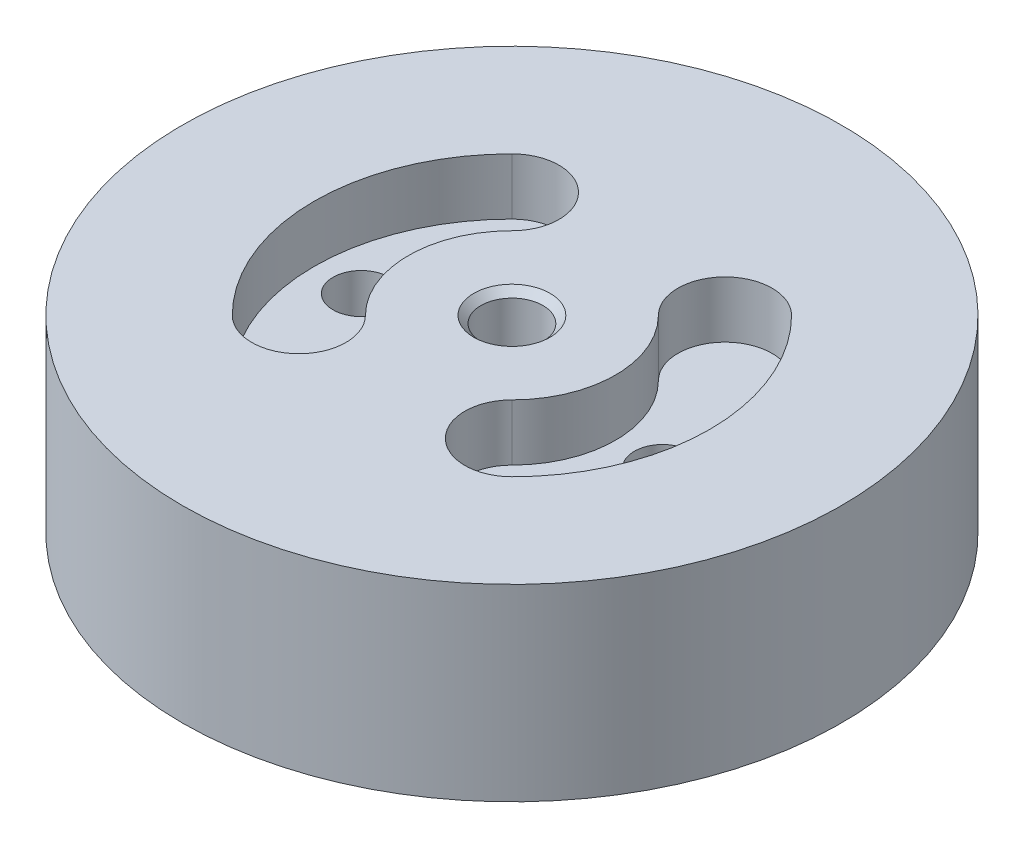
ISO-10303-21;
HEADER;
FILE_DESCRIPTION(('STEP AP214'),'2;1');
FILE_NAME('part.step','',(''),(''),'','','');
FILE_SCHEMA(('AUTOMOTIVE_DESIGN { 1 0 10303 214 1 1 1 1 }'));
ENDSEC;
DATA;
#1=APPLICATION_CONTEXT('core data for automotive mechanical design processes');
#2=APPLICATION_PROTOCOL_DEFINITION('international standard','automotive_design',2000,#1);
#3=PRODUCT_CONTEXT('',#1,'mechanical');
#4=PRODUCT('Part','Part','',(#3));
#5=PRODUCT_RELATED_PRODUCT_CATEGORY('part','',(#4));
#6=PRODUCT_DEFINITION_FORMATION('','',#4);
#7=PRODUCT_DEFINITION_CONTEXT('part definition',#1,'design');
#8=PRODUCT_DEFINITION('design','',#6,#7);
#9=PRODUCT_DEFINITION_SHAPE('','',#8);
#10=(LENGTH_UNIT() NAMED_UNIT(*) SI_UNIT(.MILLI.,.METRE.));
#11=(NAMED_UNIT(*) PLANE_ANGLE_UNIT() SI_UNIT($,.RADIAN.));
#12=(NAMED_UNIT(*) SI_UNIT($,.STERADIAN.) SOLID_ANGLE_UNIT());
#13=UNCERTAINTY_MEASURE_WITH_UNIT(LENGTH_MEASURE(1.E-05),#10,'distance_accuracy_value','');
#14=(GEOMETRIC_REPRESENTATION_CONTEXT(3) GLOBAL_UNCERTAINTY_ASSIGNED_CONTEXT((#13)) GLOBAL_UNIT_ASSIGNED_CONTEXT((#10,
#11,#12)) REPRESENTATION_CONTEXT('',''));
#15=CARTESIAN_POINT('',(0.,0.,0.));
#16=DIRECTION('',(0.,0.,1.));
#17=DIRECTION('',(1.,0.,0.));
#18=AXIS2_PLACEMENT_3D('',#15,#16,#17);
#19=CARTESIAN_POINT('',(0.,10.,0.));
#20=DIRECTION('',(0.,1.,0.));
#21=DIRECTION('',(0.,0.,1.));
#22=AXIS2_PLACEMENT_3D('',#19,#20,#21);
#23=PLANE('',#22);
#24=CARTESIAN_POINT('',(0.,10.,0.));
#25=DIRECTION('',(0.,1.,0.));
#26=DIRECTION('',(0.,0.,1.));
#27=AXIS2_PLACEMENT_3D('',#24,#25,#26);
#28=CIRCLE('',#27,2.025);
#29=CARTESIAN_POINT('',(0.,10.,2.025));
#30=VERTEX_POINT('',#29);
#31=EDGE_CURVE('E308',#30,#30,#28,.T.);
#32=ORIENTED_EDGE('',*,*,#31,.F.);
#33=EDGE_LOOP('',(#32));
#34=FACE_BOUND('',#33,.T.);
#35=CARTESIAN_POINT('',(-5.65685424949235,10.,-5.65685424949241));
#36=DIRECTION('',(0.,1.,0.));
#37=DIRECTION('',(0.,0.,1.));
#38=AXIS2_PLACEMENT_3D('',#35,#36,#37);
#39=CIRCLE('',#38,2.5);
#40=CARTESIAN_POINT('',(-3.88908729652599,10.,-3.88908729652603));
#41=VERTEX_POINT('',#40);
#42=CARTESIAN_POINT('',(-7.42462120245871,10.,-7.42462120245879));
#43=VERTEX_POINT('',#42);
#44=EDGE_CURVE('E60',#41,#43,#39,.T.);
#45=ORIENTED_EDGE('',*,*,#44,.F.);
#46=CARTESIAN_POINT('',(0.,10.,0.));
#47=DIRECTION('',(0.,1.,0.));
#48=DIRECTION('',(0.,0.,1.));
#49=AXIS2_PLACEMENT_3D('',#46,#47,#48);
#50=CIRCLE('',#49,5.5);
#51=CARTESIAN_POINT('',(-3.88908729652599,10.,3.88908729652603));
#52=VERTEX_POINT('',#51);
#53=EDGE_CURVE('E170',#41,#52,#50,.T.);
#54=ORIENTED_EDGE('',*,*,#53,.T.);
#55=CARTESIAN_POINT('',(-5.65685424949235,10.,5.65685424949241));
#56=DIRECTION('',(0.,1.,0.));
#57=DIRECTION('',(0.,0.,1.));
#58=AXIS2_PLACEMENT_3D('',#55,#56,#57);
#59=CIRCLE('',#58,2.5);
#60=CARTESIAN_POINT('',(-7.42462120245871,10.,7.42462120245879));
#61=VERTEX_POINT('',#60);
#62=EDGE_CURVE('E173',#61,#52,#59,.T.);
#63=ORIENTED_EDGE('',*,*,#62,.F.);
#64=CARTESIAN_POINT('',(0.,10.,0.));
#65=DIRECTION('',(0.,1.,0.));
#66=DIRECTION('',(0.,0.,1.));
#67=AXIS2_PLACEMENT_3D('',#64,#65,#66);
#68=CIRCLE('',#67,10.5);
#69=EDGE_CURVE('E177',#43,#61,#68,.T.);
#70=ORIENTED_EDGE('',*,*,#69,.F.);
#71=EDGE_LOOP('',(#45,#54,#63,#70));
#72=FACE_BOUND('',#71,.T.);
#73=CARTESIAN_POINT('',(0.,10.,0.));
#74=DIRECTION('',(0.,1.,0.));
#75=DIRECTION('',(0.,0.,1.));
#76=AXIS2_PLACEMENT_3D('',#73,#74,#75);
#77=CIRCLE('',#76,17.5);
#78=CARTESIAN_POINT('',(0.,10.,17.5));
#79=VERTEX_POINT('',#78);
#80=EDGE_CURVE('E11',#79,#79,#77,.T.);
#81=ORIENTED_EDGE('',*,*,#80,.T.);
#82=EDGE_LOOP('',(#81));
#83=FACE_BOUND('',#82,.T.);
#84=CARTESIAN_POINT('',(0.,10.,0.));
#85=DIRECTION('',(0.,-1.,0.));
#86=DIRECTION('',(0.,0.,-1.));
#87=AXIS2_PLACEMENT_3D('',#84,#85,#86);
#88=CIRCLE('',#87,5.5);
#89=CARTESIAN_POINT('',(3.88908729652599,10.,-3.88908729652603));
#90=VERTEX_POINT('',#89);
#91=CARTESIAN_POINT('',(3.88908729652599,10.,3.88908729652603));
#92=VERTEX_POINT('',#91);
#93=EDGE_CURVE('E138',#90,#92,#88,.T.);
#94=ORIENTED_EDGE('',*,*,#93,.F.);
#95=CARTESIAN_POINT('',(5.65685424949235,10.,-5.65685424949241));
#96=DIRECTION('',(0.,-1.,0.));
#97=DIRECTION('',(0.,0.,-1.));
#98=AXIS2_PLACEMENT_3D('',#95,#96,#97);
#99=CIRCLE('',#98,2.5);
#100=CARTESIAN_POINT('',(7.42462120245871,10.,-7.42462120245879));
#101=VERTEX_POINT('',#100);
#102=EDGE_CURVE('E52',#90,#101,#99,.T.);
#103=ORIENTED_EDGE('',*,*,#102,.T.);
#104=CARTESIAN_POINT('',(0.,10.,0.));
#105=DIRECTION('',(0.,-1.,0.));
#106=DIRECTION('',(0.,0.,-1.));
#107=AXIS2_PLACEMENT_3D('',#104,#105,#106);
#108=CIRCLE('',#107,10.5);
#109=CARTESIAN_POINT('',(7.42462120245871,10.,7.42462120245879));
#110=VERTEX_POINT('',#109);
#111=EDGE_CURVE('E147',#101,#110,#108,.T.);
#112=ORIENTED_EDGE('',*,*,#111,.T.);
#113=CARTESIAN_POINT('',(5.65685424949235,10.,5.65685424949241));
#114=DIRECTION('',(0.,-1.,0.));
#115=DIRECTION('',(0.,0.,-1.));
#116=AXIS2_PLACEMENT_3D('',#113,#114,#115);
#117=CIRCLE('',#116,2.5);
#118=EDGE_CURVE('E150',#110,#92,#117,.T.);
#119=ORIENTED_EDGE('',*,*,#118,.T.);
#120=EDGE_LOOP('',(#94,#103,#112,#119));
#121=FACE_BOUND('',#120,.T.);
#122=ADVANCED_FACE('F37',(#34,#72,#83,#121),#23,.T.);
#123=CARTESIAN_POINT('',(0.,10.,0.));
#124=DIRECTION('',(0.,-1.,0.));
#125=DIRECTION('',(0.,0.,-1.));
#126=AXIS2_PLACEMENT_3D('',#123,#124,#125);
#127=CYLINDRICAL_SURFACE('',#126,17.5);
#128=ORIENTED_EDGE('',*,*,#80,.F.);
#129=EDGE_LOOP('',(#128));
#130=FACE_BOUND('',#129,.T.);
#131=CARTESIAN_POINT('',(0.,0.,0.));
#132=DIRECTION('',(0.,1.,0.));
#133=DIRECTION('',(0.,0.,1.));
#134=AXIS2_PLACEMENT_3D('',#131,#132,#133);
#135=CIRCLE('',#134,17.5);
#136=CARTESIAN_POINT('',(0.,0.,17.5));
#137=VERTEX_POINT('',#136);
#138=EDGE_CURVE('E41',#137,#137,#135,.T.);
#139=ORIENTED_EDGE('',*,*,#138,.T.);
#140=EDGE_LOOP('',(#139));
#141=FACE_BOUND('',#140,.T.);
#142=ADVANCED_FACE('F39',(#130,#141),#127,.T.);
#143=CARTESIAN_POINT('',(0.,0.,0.));
#144=DIRECTION('',(0.,1.,0.));
#145=DIRECTION('',(0.,0.,1.));
#146=AXIS2_PLACEMENT_3D('',#143,#144,#145);
#147=PLANE('',#146);
#148=CARTESIAN_POINT('',(-8.,0.,0.));
#149=DIRECTION('',(0.,1.,0.));
#150=DIRECTION('',(0.,0.,1.));
#151=AXIS2_PLACEMENT_3D('',#148,#149,#150);
#152=CIRCLE('',#151,1.5);
#153=CARTESIAN_POINT('',(-8.,0.,1.5));
#154=VERTEX_POINT('',#153);
#155=EDGE_CURVE('E262',#154,#154,#152,.T.);
#156=ORIENTED_EDGE('',*,*,#155,.T.);
#157=EDGE_LOOP('',(#156));
#158=FACE_BOUND('',#157,.T.);
#159=CARTESIAN_POINT('',(8.,0.,0.));
#160=DIRECTION('',(0.,1.,0.));
#161=DIRECTION('',(0.,0.,1.));
#162=AXIS2_PLACEMENT_3D('',#159,#160,#161);
#163=CIRCLE('',#162,1.5);
#164=CARTESIAN_POINT('',(8.,0.,1.5));
#165=VERTEX_POINT('',#164);
#166=EDGE_CURVE('E266',#165,#165,#163,.T.);
#167=ORIENTED_EDGE('',*,*,#166,.T.);
#168=EDGE_LOOP('',(#167));
#169=FACE_BOUND('',#168,.T.);
#170=CARTESIAN_POINT('',(0.,0.,0.));
#171=DIRECTION('',(0.,1.,0.));
#172=DIRECTION('',(0.,0.,1.));
#173=AXIS2_PLACEMENT_3D('',#170,#171,#172);
#174=CIRCLE('',#173,1.65);
#175=CARTESIAN_POINT('',(0.,0.,1.65));
#176=VERTEX_POINT('',#175);
#177=EDGE_CURVE('E270',#176,#176,#174,.T.);
#178=ORIENTED_EDGE('',*,*,#177,.T.);
#179=EDGE_LOOP('',(#178));
#180=FACE_BOUND('',#179,.T.);
#181=CARTESIAN_POINT('',(0.,0.,12.5));
#182=DIRECTION('',(0.,-1.,0.));
#183=DIRECTION('',(0.,0.,-1.));
#184=AXIS2_PLACEMENT_3D('',#181,#182,#183);
#185=CIRCLE('',#184,2.025);
#186=CARTESIAN_POINT('',(0.,0.,10.475));
#187=VERTEX_POINT('',#186);
#188=EDGE_CURVE('E124',#187,#187,#185,.T.);
#189=ORIENTED_EDGE('',*,*,#188,.F.);
#190=EDGE_LOOP('',(#189));
#191=FACE_BOUND('',#190,.T.);
#192=CARTESIAN_POINT('',(0.,0.,-12.5));
#193=DIRECTION('',(0.,-1.,0.));
#194=DIRECTION('',(0.,0.,-1.));
#195=AXIS2_PLACEMENT_3D('',#192,#193,#194);
#196=CIRCLE('',#195,2.025);
#197=CARTESIAN_POINT('',(0.,0.,-14.525));
#198=VERTEX_POINT('',#197);
#199=EDGE_CURVE('E117',#198,#198,#196,.T.);
#200=ORIENTED_EDGE('',*,*,#199,.F.);
#201=EDGE_LOOP('',(#200));
#202=FACE_BOUND('',#201,.T.);
#203=ORIENTED_EDGE('',*,*,#138,.F.);
#204=EDGE_LOOP('',(#203));
#205=FACE_BOUND('',#204,.T.);
#206=ADVANCED_FACE('F244',(#158,#169,#180,#191,#202,#205),#147,.F.);
#207=CARTESIAN_POINT('',(-5.65685424949235,7.,-5.65685424949241));
#208=DIRECTION('',(0.,1.,0.));
#209=DIRECTION('',(0.,0.,1.));
#210=AXIS2_PLACEMENT_3D('',#207,#208,#209);
#211=CYLINDRICAL_SURFACE('',#210,2.5);
#212=ORIENTED_EDGE('',*,*,#44,.T.);
#213=DIRECTION('',(0.,1.,0.));
#214=VECTOR('',#213,1.);
#215=CARTESIAN_POINT('',(-7.42462120245871,7.,-7.42462120245879));
#216=LINE('',#215,#214);
#217=CARTESIAN_POINT('',(-7.42462120245871,7.,-7.42462120245879));
#218=VERTEX_POINT('',#217);
#219=EDGE_CURVE('E162',#218,#43,#216,.T.);
#220=ORIENTED_EDGE('',*,*,#219,.F.);
#221=CARTESIAN_POINT('',(-5.65685424949235,7.,-5.65685424949241));
#222=DIRECTION('',(0.,1.,0.));
#223=DIRECTION('',(0.,0.,1.));
#224=AXIS2_PLACEMENT_3D('',#221,#222,#223);
#225=CIRCLE('',#224,2.5);
#226=CARTESIAN_POINT('',(-3.88908729652599,7.,-3.88908729652603));
#227=VERTEX_POINT('',#226);
#228=EDGE_CURVE('E174',#227,#218,#225,.T.);
#229=ORIENTED_EDGE('',*,*,#228,.F.);
#230=DIRECTION('',(0.,1.,0.));
#231=VECTOR('',#230,1.);
#232=CARTESIAN_POINT('',(-3.88908729652599,7.,-3.88908729652603));
#233=LINE('',#232,#231);
#234=EDGE_CURVE('E133',#227,#41,#233,.T.);
#235=ORIENTED_EDGE('',*,*,#234,.T.);
#236=EDGE_LOOP('',(#212,#220,#229,#235));
#237=FACE_BOUND('',#236,.T.);
#238=ADVANCED_FACE('F194',(#237),#211,.F.);
#239=CARTESIAN_POINT('',(0.,7.,0.));
#240=DIRECTION('',(0.,1.,0.));
#241=DIRECTION('',(0.,0.,1.));
#242=AXIS2_PLACEMENT_3D('',#239,#240,#241);
#243=CYLINDRICAL_SURFACE('',#242,5.5);
#244=ORIENTED_EDGE('',*,*,#53,.F.);
#245=ORIENTED_EDGE('',*,*,#234,.F.);
#246=CARTESIAN_POINT('',(0.,7.,0.));
#247=DIRECTION('',(0.,1.,0.));
#248=DIRECTION('',(0.,0.,1.));
#249=AXIS2_PLACEMENT_3D('',#246,#247,#248);
#250=CIRCLE('',#249,5.5);
#251=CARTESIAN_POINT('',(-3.88908729652599,7.,3.88908729652603));
#252=VERTEX_POINT('',#251);
#253=EDGE_CURVE('E164',#227,#252,#250,.T.);
#254=ORIENTED_EDGE('',*,*,#253,.T.);
#255=DIRECTION('',(0.,1.,0.));
#256=VECTOR('',#255,1.);
#257=CARTESIAN_POINT('',(-3.88908729652599,7.,3.88908729652603));
#258=LINE('',#257,#256);
#259=EDGE_CURVE('E167',#252,#52,#258,.T.);
#260=ORIENTED_EDGE('',*,*,#259,.T.);
#261=EDGE_LOOP('',(#244,#245,#254,#260));
#262=FACE_BOUND('',#261,.T.);
#263=ADVANCED_FACE('F205',(#262),#243,.T.);
#264=CARTESIAN_POINT('',(-5.65685424949235,7.,5.65685424949241));
#265=DIRECTION('',(0.,1.,0.));
#266=DIRECTION('',(0.,0.,1.));
#267=AXIS2_PLACEMENT_3D('',#264,#265,#266);
#268=CYLINDRICAL_SURFACE('',#267,2.5);
#269=ORIENTED_EDGE('',*,*,#62,.T.);
#270=ORIENTED_EDGE('',*,*,#259,.F.);
#271=CARTESIAN_POINT('',(-5.65685424949235,7.,5.65685424949241));
#272=DIRECTION('',(0.,1.,0.));
#273=DIRECTION('',(0.,0.,1.));
#274=AXIS2_PLACEMENT_3D('',#271,#272,#273);
#275=CIRCLE('',#274,2.5);
#276=CARTESIAN_POINT('',(-7.42462120245871,7.,7.42462120245879));
#277=VERTEX_POINT('',#276);
#278=EDGE_CURVE('E182',#277,#252,#275,.T.);
#279=ORIENTED_EDGE('',*,*,#278,.F.);
#280=DIRECTION('',(0.,1.,0.));
#281=VECTOR('',#280,1.);
#282=CARTESIAN_POINT('',(-7.42462120245871,7.,7.42462120245879));
#283=LINE('',#282,#281);
#284=EDGE_CURVE('E165',#277,#61,#283,.T.);
#285=ORIENTED_EDGE('',*,*,#284,.T.);
#286=EDGE_LOOP('',(#269,#270,#279,#285));
#287=FACE_BOUND('',#286,.T.);
#288=ADVANCED_FACE('F203',(#287),#268,.F.);
#289=CARTESIAN_POINT('',(0.,7.,0.));
#290=DIRECTION('',(0.,1.,0.));
#291=DIRECTION('',(0.,0.,1.));
#292=AXIS2_PLACEMENT_3D('',#289,#290,#291);
#293=CYLINDRICAL_SURFACE('',#292,10.5);
#294=ORIENTED_EDGE('',*,*,#69,.T.);
#295=ORIENTED_EDGE('',*,*,#284,.F.);
#296=CARTESIAN_POINT('',(0.,7.,0.));
#297=DIRECTION('',(0.,1.,0.));
#298=DIRECTION('',(0.,0.,1.));
#299=AXIS2_PLACEMENT_3D('',#296,#297,#298);
#300=CIRCLE('',#299,10.5);
#301=EDGE_CURVE('E185',#218,#277,#300,.T.);
#302=ORIENTED_EDGE('',*,*,#301,.F.);
#303=ORIENTED_EDGE('',*,*,#219,.T.);
#304=EDGE_LOOP('',(#294,#295,#302,#303));
#305=FACE_BOUND('',#304,.T.);
#306=ADVANCED_FACE('F198',(#305),#293,.F.);
#307=CARTESIAN_POINT('',(-2.82842712474618,7.,-2.8284271247462));
#308=DIRECTION('',(0.,1.,0.));
#309=DIRECTION('',(0.,0.,1.));
#310=AXIS2_PLACEMENT_3D('',#307,#308,#309);
#311=PLANE('',#310);
#312=CARTESIAN_POINT('',(-8.,7.,0.));
#313=DIRECTION('',(0.,1.,0.));
#314=DIRECTION('',(0.,0.,1.));
#315=AXIS2_PLACEMENT_3D('',#312,#313,#314);
#316=CIRCLE('',#315,1.5);
#317=CARTESIAN_POINT('',(-8.,7.,1.5));
#318=VERTEX_POINT('',#317);
#319=EDGE_CURVE('E304',#318,#318,#316,.T.);
#320=ORIENTED_EDGE('',*,*,#319,.F.);
#321=EDGE_LOOP('',(#320));
#322=FACE_BOUND('',#321,.T.);
#323=ORIENTED_EDGE('',*,*,#228,.T.);
#324=ORIENTED_EDGE('',*,*,#301,.T.);
#325=ORIENTED_EDGE('',*,*,#278,.T.);
#326=ORIENTED_EDGE('',*,*,#253,.F.);
#327=EDGE_LOOP('',(#323,#324,#325,#326));
#328=FACE_BOUND('',#327,.T.);
#329=ADVANCED_FACE('F192',(#322,#328),#311,.T.);
#330=CARTESIAN_POINT('',(5.65685424949235,7.,-5.65685424949241));
#331=DIRECTION('',(0.,1.,0.));
#332=DIRECTION('',(0.,0.,1.));
#333=AXIS2_PLACEMENT_3D('',#330,#331,#332);
#334=CYLINDRICAL_SURFACE('',#333,2.5);
#335=ORIENTED_EDGE('',*,*,#102,.F.);
#336=DIRECTION('',(0.,1.,0.));
#337=VECTOR('',#336,1.);
#338=CARTESIAN_POINT('',(3.88908729652599,7.,-3.88908729652603));
#339=LINE('',#338,#337);
#340=CARTESIAN_POINT('',(3.88908729652599,7.,-3.88908729652603));
#341=VERTEX_POINT('',#340);
#342=EDGE_CURVE('E145',#341,#90,#339,.T.);
#343=ORIENTED_EDGE('',*,*,#342,.F.);
#344=CARTESIAN_POINT('',(5.65685424949235,7.,-5.65685424949241));
#345=DIRECTION('',(0.,-1.,0.));
#346=DIRECTION('',(0.,0.,-1.));
#347=AXIS2_PLACEMENT_3D('',#344,#345,#346);
#348=CIRCLE('',#347,2.5);
#349=CARTESIAN_POINT('',(7.42462120245871,7.,-7.42462120245879));
#350=VERTEX_POINT('',#349);
#351=EDGE_CURVE('E134',#341,#350,#348,.T.);
#352=ORIENTED_EDGE('',*,*,#351,.T.);
#353=DIRECTION('',(0.,1.,0.));
#354=VECTOR('',#353,1.);
#355=CARTESIAN_POINT('',(7.42462120245871,7.,-7.42462120245879));
#356=LINE('',#355,#354);
#357=EDGE_CURVE('E160',#350,#101,#356,.T.);
#358=ORIENTED_EDGE('',*,*,#357,.T.);
#359=EDGE_LOOP('',(#335,#343,#352,#358));
#360=FACE_BOUND('',#359,.T.);
#361=ADVANCED_FACE('F220',(#360),#334,.F.);
#362=CARTESIAN_POINT('',(0.,7.,0.));
#363=DIRECTION('',(0.,1.,0.));
#364=DIRECTION('',(0.,0.,1.));
#365=AXIS2_PLACEMENT_3D('',#362,#363,#364);
#366=CYLINDRICAL_SURFACE('',#365,10.5);
#367=ORIENTED_EDGE('',*,*,#111,.F.);
#368=ORIENTED_EDGE('',*,*,#357,.F.);
#369=CARTESIAN_POINT('',(0.,7.,0.));
#370=DIRECTION('',(0.,-1.,0.));
#371=DIRECTION('',(0.,0.,-1.));
#372=AXIS2_PLACEMENT_3D('',#369,#370,#371);
#373=CIRCLE('',#372,10.5);
#374=CARTESIAN_POINT('',(7.42462120245871,7.,7.42462120245879));
#375=VERTEX_POINT('',#374);
#376=EDGE_CURVE('E137',#350,#375,#373,.T.);
#377=ORIENTED_EDGE('',*,*,#376,.T.);
#378=DIRECTION('',(0.,1.,0.));
#379=VECTOR('',#378,1.);
#380=CARTESIAN_POINT('',(7.42462120245871,7.,7.42462120245879));
#381=LINE('',#380,#379);
#382=EDGE_CURVE('E158',#375,#110,#381,.T.);
#383=ORIENTED_EDGE('',*,*,#382,.T.);
#384=EDGE_LOOP('',(#367,#368,#377,#383));
#385=FACE_BOUND('',#384,.T.);
#386=ADVANCED_FACE('F227',(#385),#366,.F.);
#387=CARTESIAN_POINT('',(5.65685424949235,7.,5.65685424949241));
#388=DIRECTION('',(0.,1.,0.));
#389=DIRECTION('',(0.,0.,1.));
#390=AXIS2_PLACEMENT_3D('',#387,#388,#389);
#391=CYLINDRICAL_SURFACE('',#390,2.5);
#392=ORIENTED_EDGE('',*,*,#118,.F.);
#393=ORIENTED_EDGE('',*,*,#382,.F.);
#394=CARTESIAN_POINT('',(5.65685424949235,7.,5.65685424949241));
#395=DIRECTION('',(0.,-1.,0.));
#396=DIRECTION('',(0.,0.,-1.));
#397=AXIS2_PLACEMENT_3D('',#394,#395,#396);
#398=CIRCLE('',#397,2.5);
#399=CARTESIAN_POINT('',(3.88908729652599,7.,3.88908729652603));
#400=VERTEX_POINT('',#399);
#401=EDGE_CURVE('E140',#375,#400,#398,.T.);
#402=ORIENTED_EDGE('',*,*,#401,.T.);
#403=DIRECTION('',(0.,1.,0.));
#404=VECTOR('',#403,1.);
#405=CARTESIAN_POINT('',(3.88908729652599,7.,3.88908729652603));
#406=LINE('',#405,#404);
#407=EDGE_CURVE('E156',#400,#92,#406,.T.);
#408=ORIENTED_EDGE('',*,*,#407,.T.);
#409=EDGE_LOOP('',(#392,#393,#402,#408));
#410=FACE_BOUND('',#409,.T.);
#411=ADVANCED_FACE('F229',(#410),#391,.F.);
#412=CARTESIAN_POINT('',(0.,7.,0.));
#413=DIRECTION('',(0.,1.,0.));
#414=DIRECTION('',(0.,0.,1.));
#415=AXIS2_PLACEMENT_3D('',#412,#413,#414);
#416=CYLINDRICAL_SURFACE('',#415,5.5);
#417=ORIENTED_EDGE('',*,*,#93,.T.);
#418=ORIENTED_EDGE('',*,*,#407,.F.);
#419=CARTESIAN_POINT('',(0.,7.,0.));
#420=DIRECTION('',(0.,-1.,0.));
#421=DIRECTION('',(0.,0.,-1.));
#422=AXIS2_PLACEMENT_3D('',#419,#420,#421);
#423=CIRCLE('',#422,5.5);
#424=EDGE_CURVE('E142',#341,#400,#423,.T.);
#425=ORIENTED_EDGE('',*,*,#424,.F.);
#426=ORIENTED_EDGE('',*,*,#342,.T.);
#427=EDGE_LOOP('',(#417,#418,#425,#426));
#428=FACE_BOUND('',#427,.T.);
#429=ADVANCED_FACE('F217',(#428),#416,.T.);
#430=CARTESIAN_POINT('',(2.82842712474618,7.,-2.8284271247462));
#431=DIRECTION('',(0.,-1.,0.));
#432=DIRECTION('',(0.,0.,-1.));
#433=AXIS2_PLACEMENT_3D('',#430,#431,#432);
#434=PLANE('',#433);
#435=CARTESIAN_POINT('',(8.,7.,0.));
#436=DIRECTION('',(0.,1.,0.));
#437=DIRECTION('',(0.,0.,1.));
#438=AXIS2_PLACEMENT_3D('',#435,#436,#437);
#439=CIRCLE('',#438,1.5);
#440=CARTESIAN_POINT('',(8.,7.,1.5));
#441=VERTEX_POINT('',#440);
#442=EDGE_CURVE('E301',#441,#441,#439,.T.);
#443=ORIENTED_EDGE('',*,*,#442,.F.);
#444=EDGE_LOOP('',(#443));
#445=FACE_BOUND('',#444,.T.);
#446=ORIENTED_EDGE('',*,*,#351,.F.);
#447=ORIENTED_EDGE('',*,*,#424,.T.);
#448=ORIENTED_EDGE('',*,*,#401,.F.);
#449=ORIENTED_EDGE('',*,*,#376,.F.);
#450=EDGE_LOOP('',(#446,#447,#448,#449));
#451=FACE_BOUND('',#450,.T.);
#452=ADVANCED_FACE('F223',(#445,#451),#434,.F.);
#453=CARTESIAN_POINT('',(0.,8.,-12.5));
#454=DIRECTION('',(0.,-1.,0.));
#455=DIRECTION('',(0.,0.,-1.));
#456=AXIS2_PLACEMENT_3D('',#453,#454,#455);
#457=CONICAL_SURFACE('',#456,1.65,1.02974425867665);
#458=CARTESIAN_POINT('',(0.,8.99142002139548,-12.5));
#459=VERTEX_POINT('',#458);
#460=VERTEX_LOOP('',#459);
#461=FACE_BOUND('',#460,.T.);
#462=CARTESIAN_POINT('',(0.,8.,-12.5));
#463=DIRECTION('',(0.,-1.,0.));
#464=DIRECTION('',(0.,0.,-1.));
#465=AXIS2_PLACEMENT_3D('',#462,#463,#464);
#466=CIRCLE('',#465,1.65);
#467=CARTESIAN_POINT('',(0.,8.,-14.15));
#468=VERTEX_POINT('',#467);
#469=EDGE_CURVE('E130',#468,#468,#466,.T.);
#470=ORIENTED_EDGE('',*,*,#469,.T.);
#471=EDGE_LOOP('',(#470));
#472=FACE_BOUND('',#471,.T.);
#473=ADVANCED_FACE('F287',(#461,#472),#457,.F.);
#474=CARTESIAN_POINT('',(0.,0.,-12.5));
#475=DIRECTION('',(0.,-1.,0.));
#476=DIRECTION('',(0.,0.,-1.));
#477=AXIS2_PLACEMENT_3D('',#474,#475,#476);
#478=CYLINDRICAL_SURFACE('',#477,1.64999999999999);
#479=ORIENTED_EDGE('',*,*,#469,.F.);
#480=EDGE_LOOP('',(#479));
#481=FACE_BOUND('',#480,.T.);
#482=CARTESIAN_POINT('',(0.,0.375,-12.5));
#483=DIRECTION('',(0.,-1.,0.));
#484=DIRECTION('',(0.,0.,-1.));
#485=AXIS2_PLACEMENT_3D('',#482,#483,#484);
#486=CIRCLE('',#485,1.64999999999999);
#487=CARTESIAN_POINT('',(0.,0.375,-14.15));
#488=VERTEX_POINT('',#487);
#489=EDGE_CURVE('E121',#488,#488,#486,.T.);
#490=ORIENTED_EDGE('',*,*,#489,.T.);
#491=EDGE_LOOP('',(#490));
#492=FACE_BOUND('',#491,.T.);
#493=ADVANCED_FACE('F281',(#481,#492),#478,.F.);
#494=CARTESIAN_POINT('',(0.,0.,-12.5));
#495=DIRECTION('',(0.,-1.,0.));
#496=DIRECTION('',(0.,0.,-1.));
#497=AXIS2_PLACEMENT_3D('',#494,#495,#496);
#498=CONICAL_SURFACE('',#497,2.025,0.785398163397458);
#499=ORIENTED_EDGE('',*,*,#489,.F.);
#500=EDGE_LOOP('',(#499));
#501=FACE_BOUND('',#500,.T.);
#502=ORIENTED_EDGE('',*,*,#199,.T.);
#503=EDGE_LOOP('',(#502));
#504=FACE_BOUND('',#503,.T.);
#505=ADVANCED_FACE('F111',(#501,#504),#498,.F.);
#506=CARTESIAN_POINT('',(0.,8.,12.5));
#507=DIRECTION('',(0.,-1.,0.));
#508=DIRECTION('',(0.,0.,-1.));
#509=AXIS2_PLACEMENT_3D('',#506,#507,#508);
#510=CONICAL_SURFACE('',#509,1.65,1.02974425867665);
#511=CARTESIAN_POINT('',(0.,8.99142002139548,12.5));
#512=VERTEX_POINT('',#511);
#513=VERTEX_LOOP('',#512);
#514=FACE_BOUND('',#513,.T.);
#515=CARTESIAN_POINT('',(0.,8.,12.5));
#516=DIRECTION('',(0.,-1.,0.));
#517=DIRECTION('',(0.,0.,-1.));
#518=AXIS2_PLACEMENT_3D('',#515,#516,#517);
#519=CIRCLE('',#518,1.65);
#520=CARTESIAN_POINT('',(0.,8.,10.85));
#521=VERTEX_POINT('',#520);
#522=EDGE_CURVE('E115',#521,#521,#519,.T.);
#523=ORIENTED_EDGE('',*,*,#522,.T.);
#524=EDGE_LOOP('',(#523));
#525=FACE_BOUND('',#524,.T.);
#526=ADVANCED_FACE('F107',(#514,#525),#510,.F.);
#527=CARTESIAN_POINT('',(0.,0.,12.5));
#528=DIRECTION('',(0.,-1.,0.));
#529=DIRECTION('',(0.,0.,-1.));
#530=AXIS2_PLACEMENT_3D('',#527,#528,#529);
#531=CYLINDRICAL_SURFACE('',#530,1.64999999999999);
#532=ORIENTED_EDGE('',*,*,#522,.F.);
#533=EDGE_LOOP('',(#532));
#534=FACE_BOUND('',#533,.T.);
#535=CARTESIAN_POINT('',(0.,0.375,12.5));
#536=DIRECTION('',(0.,-1.,0.));
#537=DIRECTION('',(0.,0.,-1.));
#538=AXIS2_PLACEMENT_3D('',#535,#536,#537);
#539=CIRCLE('',#538,1.64999999999999);
#540=CARTESIAN_POINT('',(0.,0.375,10.85));
#541=VERTEX_POINT('',#540);
#542=EDGE_CURVE('E118',#541,#541,#539,.T.);
#543=ORIENTED_EDGE('',*,*,#542,.T.);
#544=EDGE_LOOP('',(#543));
#545=FACE_BOUND('',#544,.T.);
#546=ADVANCED_FACE('F110',(#534,#545),#531,.F.);
#547=CARTESIAN_POINT('',(0.,0.,12.5));
#548=DIRECTION('',(0.,-1.,0.));
#549=DIRECTION('',(0.,0.,-1.));
#550=AXIS2_PLACEMENT_3D('',#547,#548,#549);
#551=CONICAL_SURFACE('',#550,2.025,0.785398163397458);
#552=ORIENTED_EDGE('',*,*,#542,.F.);
#553=EDGE_LOOP('',(#552));
#554=FACE_BOUND('',#553,.T.);
#555=ORIENTED_EDGE('',*,*,#188,.T.);
#556=EDGE_LOOP('',(#555));
#557=FACE_BOUND('',#556,.T.);
#558=ADVANCED_FACE('F315',(#554,#557),#551,.F.);
#559=CARTESIAN_POINT('',(0.,10.,0.));
#560=DIRECTION('',(0.,1.,0.));
#561=DIRECTION('',(0.,0.,1.));
#562=AXIS2_PLACEMENT_3D('',#559,#560,#561);
#563=CYLINDRICAL_SURFACE('',#562,1.65);
#564=ORIENTED_EDGE('',*,*,#177,.F.);
#565=EDGE_LOOP('',(#564));
#566=FACE_BOUND('',#565,.T.);
#567=CARTESIAN_POINT('',(0.,9.625,0.));
#568=DIRECTION('',(0.,1.,0.));
#569=DIRECTION('',(0.,0.,1.));
#570=AXIS2_PLACEMENT_3D('',#567,#568,#569);
#571=CIRCLE('',#570,1.65);
#572=CARTESIAN_POINT('',(0.,9.625,1.65));
#573=VERTEX_POINT('',#572);
#574=EDGE_CURVE('E311',#573,#573,#571,.T.);
#575=ORIENTED_EDGE('',*,*,#574,.T.);
#576=EDGE_LOOP('',(#575));
#577=FACE_BOUND('',#576,.T.);
#578=ADVANCED_FACE('F317',(#566,#577),#563,.F.);
#579=CARTESIAN_POINT('',(0.,10.,0.));
#580=DIRECTION('',(0.,1.,0.));
#581=DIRECTION('',(0.,0.,1.));
#582=AXIS2_PLACEMENT_3D('',#579,#580,#581);
#583=CONICAL_SURFACE('',#582,2.025,0.785398163397447);
#584=ORIENTED_EDGE('',*,*,#574,.F.);
#585=EDGE_LOOP('',(#584));
#586=FACE_BOUND('',#585,.T.);
#587=ORIENTED_EDGE('',*,*,#31,.T.);
#588=EDGE_LOOP('',(#587));
#589=FACE_BOUND('',#588,.T.);
#590=ADVANCED_FACE('F324',(#586,#589),#583,.F.);
#591=CARTESIAN_POINT('',(8.,0.,0.));
#592=DIRECTION('',(0.,1.,0.));
#593=DIRECTION('',(0.,0.,1.));
#594=AXIS2_PLACEMENT_3D('',#591,#592,#593);
#595=CYLINDRICAL_SURFACE('',#594,1.5);
#596=ORIENTED_EDGE('',*,*,#166,.F.);
#597=EDGE_LOOP('',(#596));
#598=FACE_BOUND('',#597,.T.);
#599=ORIENTED_EDGE('',*,*,#442,.T.);
#600=EDGE_LOOP('',(#599));
#601=FACE_BOUND('',#600,.T.);
#602=ADVANCED_FACE('F331',(#598,#601),#595,.F.);
#603=CARTESIAN_POINT('',(-8.,0.,0.));
#604=DIRECTION('',(0.,1.,0.));
#605=DIRECTION('',(0.,0.,1.));
#606=AXIS2_PLACEMENT_3D('',#603,#604,#605);
#607=CYLINDRICAL_SURFACE('',#606,1.5);
#608=ORIENTED_EDGE('',*,*,#155,.F.);
#609=EDGE_LOOP('',(#608));
#610=FACE_BOUND('',#609,.T.);
#611=ORIENTED_EDGE('',*,*,#319,.T.);
#612=EDGE_LOOP('',(#611));
#613=FACE_BOUND('',#612,.T.);
#614=ADVANCED_FACE('F335',(#610,#613),#607,.F.);
#615=CLOSED_SHELL('',(#122,#142,#206,#238,#263,#288,#306,#329,#361,#386,#411,#429,#452,#473,
#493,#505,#526,#546,#558,#578,#590,#602,#614));
#616=MANIFOLD_SOLID_BREP('B2',#615);
#617=ADVANCED_BREP_SHAPE_REPRESENTATION('',(#18,#616),#14);
#618=SHAPE_DEFINITION_REPRESENTATION(#9,#617);
ENDSEC;
END-ISO-10303-21;
